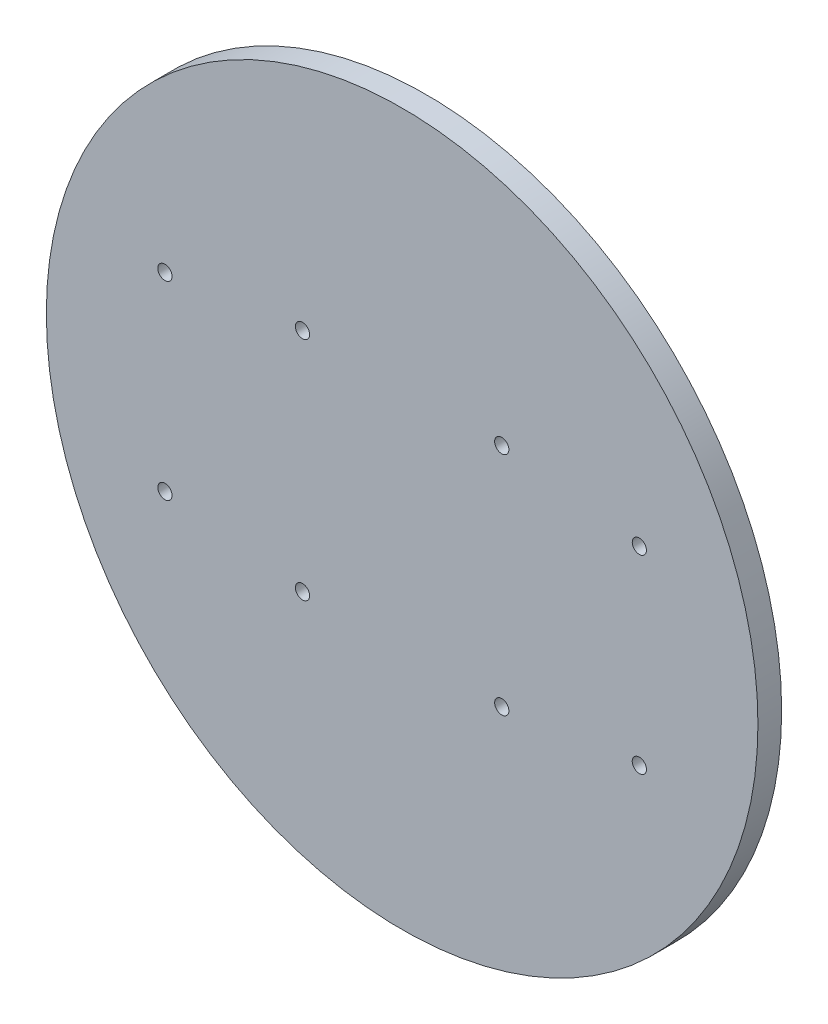
ISO-10303-21;
HEADER;
FILE_DESCRIPTION(('STEP AP214'),'2;1');
FILE_NAME('part.step','',(''),(''),'','','');
FILE_SCHEMA(('AUTOMOTIVE_DESIGN { 1 0 10303 214 1 1 1 1 }'));
ENDSEC;
DATA;
#1=APPLICATION_CONTEXT('core data for automotive mechanical design processes');
#2=APPLICATION_PROTOCOL_DEFINITION('international standard','automotive_design',2000,#1);
#3=PRODUCT_CONTEXT('',#1,'mechanical');
#4=PRODUCT('Part','Part','',(#3));
#5=PRODUCT_RELATED_PRODUCT_CATEGORY('part','',(#4));
#6=PRODUCT_DEFINITION_FORMATION('','',#4);
#7=PRODUCT_DEFINITION_CONTEXT('part definition',#1,'design');
#8=PRODUCT_DEFINITION('design','',#6,#7);
#9=PRODUCT_DEFINITION_SHAPE('','',#8);
#10=(LENGTH_UNIT() NAMED_UNIT(*) SI_UNIT(.MILLI.,.METRE.));
#11=(NAMED_UNIT(*) PLANE_ANGLE_UNIT() SI_UNIT($,.RADIAN.));
#12=(NAMED_UNIT(*) SI_UNIT($,.STERADIAN.) SOLID_ANGLE_UNIT());
#13=UNCERTAINTY_MEASURE_WITH_UNIT(LENGTH_MEASURE(1.E-05),#10,'distance_accuracy_value','');
#14=(GEOMETRIC_REPRESENTATION_CONTEXT(3) GLOBAL_UNCERTAINTY_ASSIGNED_CONTEXT((#13)) GLOBAL_UNIT_ASSIGNED_CONTEXT((#10,
#11,#12)) REPRESENTATION_CONTEXT('',''));
#15=CARTESIAN_POINT('',(0.,0.,0.));
#16=DIRECTION('',(0.,0.,1.));
#17=DIRECTION('',(1.,0.,0.));
#18=AXIS2_PLACEMENT_3D('',#15,#16,#17);
#19=CARTESIAN_POINT('',(0.,0.,5.));
#20=DIRECTION('',(0.,0.,-1.));
#21=DIRECTION('',(-1.,0.,0.));
#22=AXIS2_PLACEMENT_3D('',#19,#20,#21);
#23=CYLINDRICAL_SURFACE('',#22,75.);
#24=CARTESIAN_POINT('',(0.,0.,5.));
#25=DIRECTION('',(0.,0.,1.));
#26=DIRECTION('',(1.,0.,0.));
#27=AXIS2_PLACEMENT_3D('',#24,#25,#26);
#28=CIRCLE('',#27,75.);
#29=CARTESIAN_POINT('',(75.,0.,5.));
#30=VERTEX_POINT('',#29);
#31=EDGE_CURVE('E10',#30,#30,#28,.T.);
#32=ORIENTED_EDGE('',*,*,#31,.F.);
#33=EDGE_LOOP('',(#32));
#34=FACE_BOUND('',#33,.T.);
#35=CARTESIAN_POINT('',(0.,0.,0.));
#36=DIRECTION('',(0.,0.,1.));
#37=DIRECTION('',(1.,0.,0.));
#38=AXIS2_PLACEMENT_3D('',#35,#36,#37);
#39=CIRCLE('',#38,75.);
#40=CARTESIAN_POINT('',(75.,0.,0.));
#41=VERTEX_POINT('',#40);
#42=EDGE_CURVE('E35',#41,#41,#39,.T.);
#43=ORIENTED_EDGE('',*,*,#42,.T.);
#44=EDGE_LOOP('',(#43));
#45=FACE_BOUND('',#44,.T.);
#46=ADVANCED_FACE('F32',(#34,#45),#23,.T.);
#47=CARTESIAN_POINT('',(0.,0.,5.));
#48=DIRECTION('',(0.,0.,1.));
#49=DIRECTION('',(1.,0.,0.));
#50=AXIS2_PLACEMENT_3D('',#47,#48,#49);
#51=PLANE('',#50);
#52=CARTESIAN_POINT('',(21.,-23.8,5.));
#53=DIRECTION('',(0.,0.,1.));
#54=DIRECTION('',(1.,0.,0.));
#55=AXIS2_PLACEMENT_3D('',#52,#53,#54);
#56=CIRCLE('',#55,1.5);
#57=CARTESIAN_POINT('',(22.5,-23.8,5.));
#58=VERTEX_POINT('',#57);
#59=EDGE_CURVE('E86',#58,#58,#56,.T.);
#60=ORIENTED_EDGE('',*,*,#59,.F.);
#61=EDGE_LOOP('',(#60));
#62=FACE_BOUND('',#61,.T.);
#63=CARTESIAN_POINT('',(-21.,-23.8,5.));
#64=DIRECTION('',(0.,0.,1.));
#65=DIRECTION('',(1.,0.,0.));
#66=AXIS2_PLACEMENT_3D('',#63,#64,#65);
#67=CIRCLE('',#66,1.5);
#68=CARTESIAN_POINT('',(-19.5,-23.8,5.));
#69=VERTEX_POINT('',#68);
#70=EDGE_CURVE('E80',#69,#69,#67,.T.);
#71=ORIENTED_EDGE('',*,*,#70,.F.);
#72=EDGE_LOOP('',(#71));
#73=FACE_BOUND('',#72,.T.);
#74=CARTESIAN_POINT('',(-21.,23.876,5.));
#75=DIRECTION('',(0.,0.,1.));
#76=DIRECTION('',(1.,0.,0.));
#77=AXIS2_PLACEMENT_3D('',#74,#75,#76);
#78=CIRCLE('',#77,1.5);
#79=CARTESIAN_POINT('',(-19.5,23.876,5.));
#80=VERTEX_POINT('',#79);
#81=EDGE_CURVE('E74',#80,#80,#78,.T.);
#82=ORIENTED_EDGE('',*,*,#81,.F.);
#83=EDGE_LOOP('',(#82));
#84=FACE_BOUND('',#83,.T.);
#85=CARTESIAN_POINT('',(21.,23.876,5.));
#86=DIRECTION('',(0.,0.,1.));
#87=DIRECTION('',(1.,0.,0.));
#88=AXIS2_PLACEMENT_3D('',#85,#86,#87);
#89=CIRCLE('',#88,1.5);
#90=CARTESIAN_POINT('',(22.5,23.876,5.));
#91=VERTEX_POINT('',#90);
#92=EDGE_CURVE('E68',#91,#91,#89,.T.);
#93=ORIENTED_EDGE('',*,*,#92,.F.);
#94=EDGE_LOOP('',(#93));
#95=FACE_BOUND('',#94,.T.);
#96=CARTESIAN_POINT('',(50.,20.,5.));
#97=DIRECTION('',(0.,0.,1.));
#98=DIRECTION('',(-1.,0.,0.));
#99=AXIS2_PLACEMENT_3D('',#96,#97,#98);
#100=CIRCLE('',#99,1.5);
#101=CARTESIAN_POINT('',(48.5,20.,5.));
#102=VERTEX_POINT('',#101);
#103=EDGE_CURVE('E62',#102,#102,#100,.T.);
#104=ORIENTED_EDGE('',*,*,#103,.F.);
#105=EDGE_LOOP('',(#104));
#106=FACE_BOUND('',#105,.T.);
#107=CARTESIAN_POINT('',(50.,-20.,5.));
#108=DIRECTION('',(0.,0.,1.));
#109=DIRECTION('',(1.,0.,0.));
#110=AXIS2_PLACEMENT_3D('',#107,#108,#109);
#111=CIRCLE('',#110,1.5);
#112=CARTESIAN_POINT('',(51.5,-20.,5.));
#113=VERTEX_POINT('',#112);
#114=EDGE_CURVE('E56',#113,#113,#111,.T.);
#115=ORIENTED_EDGE('',*,*,#114,.F.);
#116=EDGE_LOOP('',(#115));
#117=FACE_BOUND('',#116,.T.);
#118=CARTESIAN_POINT('',(-50.,-20.,5.));
#119=DIRECTION('',(0.,0.,1.));
#120=DIRECTION('',(-1.,0.,0.));
#121=AXIS2_PLACEMENT_3D('',#118,#119,#120);
#122=CIRCLE('',#121,1.5);
#123=CARTESIAN_POINT('',(-51.5,-20.,5.));
#124=VERTEX_POINT('',#123);
#125=EDGE_CURVE('E50',#124,#124,#122,.T.);
#126=ORIENTED_EDGE('',*,*,#125,.F.);
#127=EDGE_LOOP('',(#126));
#128=FACE_BOUND('',#127,.T.);
#129=CARTESIAN_POINT('',(-50.,20.,5.));
#130=DIRECTION('',(0.,0.,1.));
#131=DIRECTION('',(1.,0.,0.));
#132=AXIS2_PLACEMENT_3D('',#129,#130,#131);
#133=CIRCLE('',#132,1.5);
#134=CARTESIAN_POINT('',(-48.5,20.,5.));
#135=VERTEX_POINT('',#134);
#136=EDGE_CURVE('E44',#135,#135,#133,.T.);
#137=ORIENTED_EDGE('',*,*,#136,.F.);
#138=EDGE_LOOP('',(#137));
#139=FACE_BOUND('',#138,.T.);
#140=ORIENTED_EDGE('',*,*,#31,.T.);
#141=EDGE_LOOP('',(#140));
#142=FACE_BOUND('',#141,.T.);
#143=ADVANCED_FACE('F102',(#62,#73,#84,#95,#106,#117,#128,#139,#142),#51,.T.);
#144=CARTESIAN_POINT('',(0.,0.,0.));
#145=DIRECTION('',(0.,0.,1.));
#146=DIRECTION('',(1.,0.,0.));
#147=AXIS2_PLACEMENT_3D('',#144,#145,#146);
#148=PLANE('',#147);
#149=CARTESIAN_POINT('',(21.,-23.8,0.));
#150=DIRECTION('',(0.,0.,1.));
#151=DIRECTION('',(1.,0.,0.));
#152=AXIS2_PLACEMENT_3D('',#149,#150,#151);
#153=CIRCLE('',#152,1.5);
#154=CARTESIAN_POINT('',(22.5,-23.8,0.));
#155=VERTEX_POINT('',#154);
#156=EDGE_CURVE('E83',#155,#155,#153,.T.);
#157=ORIENTED_EDGE('',*,*,#156,.T.);
#158=EDGE_LOOP('',(#157));
#159=FACE_BOUND('',#158,.T.);
#160=CARTESIAN_POINT('',(-21.,-23.8,0.));
#161=DIRECTION('',(0.,0.,1.));
#162=DIRECTION('',(1.,0.,0.));
#163=AXIS2_PLACEMENT_3D('',#160,#161,#162);
#164=CIRCLE('',#163,1.5);
#165=CARTESIAN_POINT('',(-19.5,-23.8,0.));
#166=VERTEX_POINT('',#165);
#167=EDGE_CURVE('E77',#166,#166,#164,.T.);
#168=ORIENTED_EDGE('',*,*,#167,.T.);
#169=EDGE_LOOP('',(#168));
#170=FACE_BOUND('',#169,.T.);
#171=CARTESIAN_POINT('',(-21.,23.876,0.));
#172=DIRECTION('',(0.,0.,1.));
#173=DIRECTION('',(1.,0.,0.));
#174=AXIS2_PLACEMENT_3D('',#171,#172,#173);
#175=CIRCLE('',#174,1.5);
#176=CARTESIAN_POINT('',(-19.5,23.876,0.));
#177=VERTEX_POINT('',#176);
#178=EDGE_CURVE('E71',#177,#177,#175,.T.);
#179=ORIENTED_EDGE('',*,*,#178,.T.);
#180=EDGE_LOOP('',(#179));
#181=FACE_BOUND('',#180,.T.);
#182=CARTESIAN_POINT('',(21.,23.876,0.));
#183=DIRECTION('',(0.,0.,1.));
#184=DIRECTION('',(1.,0.,0.));
#185=AXIS2_PLACEMENT_3D('',#182,#183,#184);
#186=CIRCLE('',#185,1.5);
#187=CARTESIAN_POINT('',(22.5,23.876,0.));
#188=VERTEX_POINT('',#187);
#189=EDGE_CURVE('E65',#188,#188,#186,.T.);
#190=ORIENTED_EDGE('',*,*,#189,.T.);
#191=EDGE_LOOP('',(#190));
#192=FACE_BOUND('',#191,.T.);
#193=CARTESIAN_POINT('',(50.,20.,0.));
#194=DIRECTION('',(0.,0.,1.));
#195=DIRECTION('',(-1.,0.,0.));
#196=AXIS2_PLACEMENT_3D('',#193,#194,#195);
#197=CIRCLE('',#196,1.5);
#198=CARTESIAN_POINT('',(48.5,20.,0.));
#199=VERTEX_POINT('',#198);
#200=EDGE_CURVE('E59',#199,#199,#197,.T.);
#201=ORIENTED_EDGE('',*,*,#200,.T.);
#202=EDGE_LOOP('',(#201));
#203=FACE_BOUND('',#202,.T.);
#204=CARTESIAN_POINT('',(50.,-20.,0.));
#205=DIRECTION('',(0.,0.,1.));
#206=DIRECTION('',(1.,0.,0.));
#207=AXIS2_PLACEMENT_3D('',#204,#205,#206);
#208=CIRCLE('',#207,1.5);
#209=CARTESIAN_POINT('',(51.5,-20.,0.));
#210=VERTEX_POINT('',#209);
#211=EDGE_CURVE('E53',#210,#210,#208,.T.);
#212=ORIENTED_EDGE('',*,*,#211,.T.);
#213=EDGE_LOOP('',(#212));
#214=FACE_BOUND('',#213,.T.);
#215=CARTESIAN_POINT('',(-50.,-20.,0.));
#216=DIRECTION('',(0.,0.,1.));
#217=DIRECTION('',(-1.,0.,0.));
#218=AXIS2_PLACEMENT_3D('',#215,#216,#217);
#219=CIRCLE('',#218,1.5);
#220=CARTESIAN_POINT('',(-51.5,-20.,0.));
#221=VERTEX_POINT('',#220);
#222=EDGE_CURVE('E47',#221,#221,#219,.T.);
#223=ORIENTED_EDGE('',*,*,#222,.T.);
#224=EDGE_LOOP('',(#223));
#225=FACE_BOUND('',#224,.T.);
#226=CARTESIAN_POINT('',(-50.,20.,0.));
#227=DIRECTION('',(0.,0.,1.));
#228=DIRECTION('',(1.,0.,0.));
#229=AXIS2_PLACEMENT_3D('',#226,#227,#228);
#230=CIRCLE('',#229,1.5);
#231=CARTESIAN_POINT('',(-48.5,20.,0.));
#232=VERTEX_POINT('',#231);
#233=EDGE_CURVE('E42',#232,#232,#230,.T.);
#234=ORIENTED_EDGE('',*,*,#233,.T.);
#235=EDGE_LOOP('',(#234));
#236=FACE_BOUND('',#235,.T.);
#237=ORIENTED_EDGE('',*,*,#42,.F.);
#238=EDGE_LOOP('',(#237));
#239=FACE_BOUND('',#238,.T.);
#240=ADVANCED_FACE('F92',(#159,#170,#181,#192,#203,#214,#225,#236,#239),#148,.F.);
#241=CARTESIAN_POINT('',(-50.,20.,0.));
#242=DIRECTION('',(0.,0.,1.));
#243=DIRECTION('',(1.,0.,0.));
#244=AXIS2_PLACEMENT_3D('',#241,#242,#243);
#245=CYLINDRICAL_SURFACE('',#244,1.5);
#246=ORIENTED_EDGE('',*,*,#233,.F.);
#247=EDGE_LOOP('',(#246));
#248=FACE_BOUND('',#247,.T.);
#249=ORIENTED_EDGE('',*,*,#136,.T.);
#250=EDGE_LOOP('',(#249));
#251=FACE_BOUND('',#250,.T.);
#252=ADVANCED_FACE('F120',(#248,#251),#245,.F.);
#253=CARTESIAN_POINT('',(-50.,-20.,0.));
#254=DIRECTION('',(0.,0.,1.));
#255=DIRECTION('',(1.,0.,0.));
#256=AXIS2_PLACEMENT_3D('',#253,#254,#255);
#257=CYLINDRICAL_SURFACE('',#256,1.5);
#258=ORIENTED_EDGE('',*,*,#222,.F.);
#259=EDGE_LOOP('',(#258));
#260=FACE_BOUND('',#259,.T.);
#261=ORIENTED_EDGE('',*,*,#125,.T.);
#262=EDGE_LOOP('',(#261));
#263=FACE_BOUND('',#262,.T.);
#264=ADVANCED_FACE('F122',(#260,#263),#257,.F.);
#265=CARTESIAN_POINT('',(50.,-20.,0.));
#266=DIRECTION('',(0.,0.,1.));
#267=DIRECTION('',(1.,0.,0.));
#268=AXIS2_PLACEMENT_3D('',#265,#266,#267);
#269=CYLINDRICAL_SURFACE('',#268,1.5);
#270=ORIENTED_EDGE('',*,*,#211,.F.);
#271=EDGE_LOOP('',(#270));
#272=FACE_BOUND('',#271,.T.);
#273=ORIENTED_EDGE('',*,*,#114,.T.);
#274=EDGE_LOOP('',(#273));
#275=FACE_BOUND('',#274,.T.);
#276=ADVANCED_FACE('F129',(#272,#275),#269,.F.);
#277=CARTESIAN_POINT('',(50.,20.,0.));
#278=DIRECTION('',(0.,0.,1.));
#279=DIRECTION('',(1.,0.,0.));
#280=AXIS2_PLACEMENT_3D('',#277,#278,#279);
#281=CYLINDRICAL_SURFACE('',#280,1.5);
#282=ORIENTED_EDGE('',*,*,#200,.F.);
#283=EDGE_LOOP('',(#282));
#284=FACE_BOUND('',#283,.T.);
#285=ORIENTED_EDGE('',*,*,#103,.T.);
#286=EDGE_LOOP('',(#285));
#287=FACE_BOUND('',#286,.T.);
#288=ADVANCED_FACE('F169',(#284,#287),#281,.F.);
#289=CARTESIAN_POINT('',(21.,23.876,0.));
#290=DIRECTION('',(0.,0.,1.));
#291=DIRECTION('',(1.,0.,0.));
#292=AXIS2_PLACEMENT_3D('',#289,#290,#291);
#293=CYLINDRICAL_SURFACE('',#292,1.5);
#294=ORIENTED_EDGE('',*,*,#189,.F.);
#295=EDGE_LOOP('',(#294));
#296=FACE_BOUND('',#295,.T.);
#297=ORIENTED_EDGE('',*,*,#92,.T.);
#298=EDGE_LOOP('',(#297));
#299=FACE_BOUND('',#298,.T.);
#300=ADVANCED_FACE('F179',(#296,#299),#293,.F.);
#301=CARTESIAN_POINT('',(-21.,23.876,0.));
#302=DIRECTION('',(0.,0.,1.));
#303=DIRECTION('',(1.,0.,0.));
#304=AXIS2_PLACEMENT_3D('',#301,#302,#303);
#305=CYLINDRICAL_SURFACE('',#304,1.5);
#306=ORIENTED_EDGE('',*,*,#178,.F.);
#307=EDGE_LOOP('',(#306));
#308=FACE_BOUND('',#307,.T.);
#309=ORIENTED_EDGE('',*,*,#81,.T.);
#310=EDGE_LOOP('',(#309));
#311=FACE_BOUND('',#310,.T.);
#312=ADVANCED_FACE('F189',(#308,#311),#305,.F.);
#313=CARTESIAN_POINT('',(-21.,-23.8,0.));
#314=DIRECTION('',(0.,0.,1.));
#315=DIRECTION('',(1.,0.,0.));
#316=AXIS2_PLACEMENT_3D('',#313,#314,#315);
#317=CYLINDRICAL_SURFACE('',#316,1.5);
#318=ORIENTED_EDGE('',*,*,#167,.F.);
#319=EDGE_LOOP('',(#318));
#320=FACE_BOUND('',#319,.T.);
#321=ORIENTED_EDGE('',*,*,#70,.T.);
#322=EDGE_LOOP('',(#321));
#323=FACE_BOUND('',#322,.T.);
#324=ADVANCED_FACE('F98',(#320,#323),#317,.F.);
#325=CARTESIAN_POINT('',(21.,-23.8,0.));
#326=DIRECTION('',(0.,0.,1.));
#327=DIRECTION('',(1.,0.,0.));
#328=AXIS2_PLACEMENT_3D('',#325,#326,#327);
#329=CYLINDRICAL_SURFACE('',#328,1.5);
#330=ORIENTED_EDGE('',*,*,#156,.F.);
#331=EDGE_LOOP('',(#330));
#332=FACE_BOUND('',#331,.T.);
#333=ORIENTED_EDGE('',*,*,#59,.T.);
#334=EDGE_LOOP('',(#333));
#335=FACE_BOUND('',#334,.T.);
#336=ADVANCED_FACE('F95',(#332,#335),#329,.F.);
#337=CLOSED_SHELL('',(#46,#143,#240,#252,#264,#276,#288,#300,#312,#324,#336));
#338=MANIFOLD_SOLID_BREP('B2',#337);
#339=ADVANCED_BREP_SHAPE_REPRESENTATION('',(#18,#338),#14);
#340=SHAPE_DEFINITION_REPRESENTATION(#9,#339);
ENDSEC;
END-ISO-10303-21;
